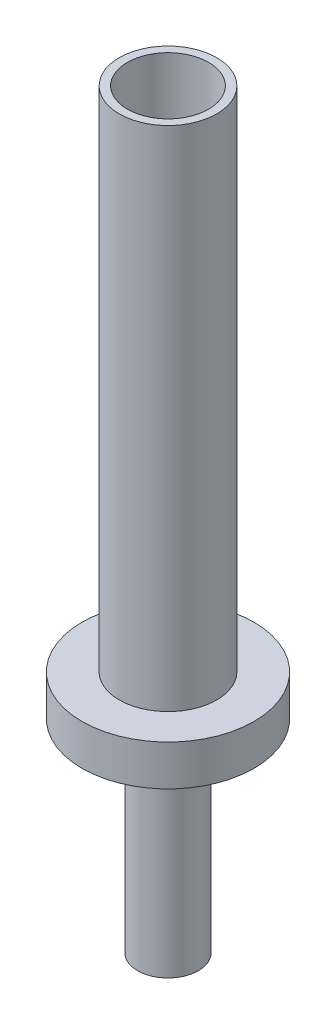
ISO-10303-21;
HEADER;
FILE_DESCRIPTION(('STEP AP214'),'2;1');
FILE_NAME('part.step','',(''),(''),'','','');
FILE_SCHEMA(('AUTOMOTIVE_DESIGN { 1 0 10303 214 1 1 1 1 }'));
ENDSEC;
DATA;
#1=APPLICATION_CONTEXT('core data for automotive mechanical design processes');
#2=APPLICATION_PROTOCOL_DEFINITION('international standard','automotive_design',2000,#1);
#3=PRODUCT_CONTEXT('',#1,'mechanical');
#4=PRODUCT('Part','Part','',(#3));
#5=PRODUCT_RELATED_PRODUCT_CATEGORY('part','',(#4));
#6=PRODUCT_DEFINITION_FORMATION('','',#4);
#7=PRODUCT_DEFINITION_CONTEXT('part definition',#1,'design');
#8=PRODUCT_DEFINITION('design','',#6,#7);
#9=PRODUCT_DEFINITION_SHAPE('','',#8);
#10=(LENGTH_UNIT() NAMED_UNIT(*) SI_UNIT(.MILLI.,.METRE.));
#11=(NAMED_UNIT(*) PLANE_ANGLE_UNIT() SI_UNIT($,.RADIAN.));
#12=(NAMED_UNIT(*) SI_UNIT($,.STERADIAN.) SOLID_ANGLE_UNIT());
#13=UNCERTAINTY_MEASURE_WITH_UNIT(LENGTH_MEASURE(1.E-05),#10,'distance_accuracy_value','');
#14=(GEOMETRIC_REPRESENTATION_CONTEXT(3) GLOBAL_UNCERTAINTY_ASSIGNED_CONTEXT((#13)) GLOBAL_UNIT_ASSIGNED_CONTEXT((#10,
#11,#12)) REPRESENTATION_CONTEXT('',''));
#15=CARTESIAN_POINT('',(0.,0.,0.));
#16=DIRECTION('',(0.,0.,1.));
#17=DIRECTION('',(1.,0.,0.));
#18=AXIS2_PLACEMENT_3D('',#15,#16,#17);
#19=CARTESIAN_POINT('',(0.,50.,0.));
#20=DIRECTION('',(0.,-1.,0.));
#21=DIRECTION('',(0.,0.,-1.));
#22=AXIS2_PLACEMENT_3D('',#19,#20,#21);
#23=CYLINDRICAL_SURFACE('',#22,7.49999999999999);
#24=CARTESIAN_POINT('',(0.,50.,0.));
#25=DIRECTION('',(0.,1.,0.));
#26=DIRECTION('',(0.,0.,1.));
#27=AXIS2_PLACEMENT_3D('',#24,#25,#26);
#28=CIRCLE('',#27,7.49999999999999);
#29=CARTESIAN_POINT('',(0.,50.,7.49999999999999));
#30=VERTEX_POINT('',#29);
#31=EDGE_CURVE('E43',#30,#30,#28,.T.);
#32=ORIENTED_EDGE('',*,*,#31,.F.);
#33=EDGE_LOOP('',(#32));
#34=FACE_BOUND('',#33,.T.);
#35=CARTESIAN_POINT('',(0.,0.,0.));
#36=DIRECTION('',(0.,1.,0.));
#37=DIRECTION('',(0.,0.,1.));
#38=AXIS2_PLACEMENT_3D('',#35,#36,#37);
#39=CIRCLE('',#38,7.49999999999999);
#40=CARTESIAN_POINT('',(0.,0.,7.49999999999999));
#41=VERTEX_POINT('',#40);
#42=EDGE_CURVE('E47',#41,#41,#39,.T.);
#43=ORIENTED_EDGE('',*,*,#42,.T.);
#44=EDGE_LOOP('',(#43));
#45=FACE_BOUND('',#44,.T.);
#46=ADVANCED_FACE('F37',(#34,#45),#23,.T.);
#47=CARTESIAN_POINT('',(0.,0.,0.));
#48=DIRECTION('',(0.,1.,0.));
#49=DIRECTION('',(0.,0.,1.));
#50=AXIS2_PLACEMENT_3D('',#47,#48,#49);
#51=PLANE('',#50);
#52=ORIENTED_EDGE('',*,*,#42,.F.);
#53=EDGE_LOOP('',(#52));
#54=FACE_BOUND('',#53,.T.);
#55=ADVANCED_FACE('F88',(#54),#51,.F.);
#56=CARTESIAN_POINT('',(0.,60.,0.));
#57=DIRECTION('',(0.,-1.,0.));
#58=DIRECTION('',(0.,0.,-1.));
#59=AXIS2_PLACEMENT_3D('',#56,#57,#58);
#60=CYLINDRICAL_SURFACE('',#59,21.18392150893);
#61=CARTESIAN_POINT('',(0.,60.,0.));
#62=DIRECTION('',(0.,1.,0.));
#63=DIRECTION('',(0.,0.,1.));
#64=AXIS2_PLACEMENT_3D('',#61,#62,#63);
#65=CIRCLE('',#64,21.18392150893);
#66=CARTESIAN_POINT('',(0.,60.,21.18392150893));
#67=VERTEX_POINT('',#66);
#68=EDGE_CURVE('E52',#67,#67,#65,.T.);
#69=ORIENTED_EDGE('',*,*,#68,.F.);
#70=EDGE_LOOP('',(#69));
#71=FACE_BOUND('',#70,.T.);
#72=CARTESIAN_POINT('',(0.,50.,0.));
#73=DIRECTION('',(0.,1.,0.));
#74=DIRECTION('',(0.,0.,1.));
#75=AXIS2_PLACEMENT_3D('',#72,#73,#74);
#76=CIRCLE('',#75,21.18392150893);
#77=CARTESIAN_POINT('',(0.,50.,21.18392150893));
#78=VERTEX_POINT('',#77);
#79=EDGE_CURVE('E54',#78,#78,#76,.T.);
#80=ORIENTED_EDGE('',*,*,#79,.T.);
#81=EDGE_LOOP('',(#80));
#82=FACE_BOUND('',#81,.T.);
#83=ADVANCED_FACE('F93',(#71,#82),#60,.T.);
#84=CARTESIAN_POINT('',(0.,60.,0.));
#85=DIRECTION('',(0.,1.,0.));
#86=DIRECTION('',(0.,0.,1.));
#87=AXIS2_PLACEMENT_3D('',#84,#85,#86);
#88=PLANE('',#87);
#89=CARTESIAN_POINT('',(0.,60.,0.));
#90=DIRECTION('',(0.,1.,0.));
#91=DIRECTION('',(0.,0.,1.));
#92=AXIS2_PLACEMENT_3D('',#89,#90,#91);
#93=CIRCLE('',#92,12.);
#94=CARTESIAN_POINT('',(0.,60.,12.));
#95=VERTEX_POINT('',#94);
#96=EDGE_CURVE('E60',#95,#95,#93,.T.);
#97=ORIENTED_EDGE('',*,*,#96,.F.);
#98=EDGE_LOOP('',(#97));
#99=FACE_BOUND('',#98,.T.);
#100=ORIENTED_EDGE('',*,*,#68,.T.);
#101=EDGE_LOOP('',(#100));
#102=FACE_BOUND('',#101,.T.);
#103=ADVANCED_FACE('F84',(#99,#102),#88,.T.);
#104=CARTESIAN_POINT('',(0.,50.,0.));
#105=DIRECTION('',(0.,1.,0.));
#106=DIRECTION('',(0.,0.,1.));
#107=AXIS2_PLACEMENT_3D('',#104,#105,#106);
#108=PLANE('',#107);
#109=ORIENTED_EDGE('',*,*,#31,.T.);
#110=EDGE_LOOP('',(#109));
#111=FACE_BOUND('',#110,.T.);
#112=ORIENTED_EDGE('',*,*,#79,.F.);
#113=EDGE_LOOP('',(#112));
#114=FACE_BOUND('',#113,.T.);
#115=ADVANCED_FACE('F74',(#111,#114),#108,.F.);
#116=CARTESIAN_POINT('',(0.,185.,0.));
#117=DIRECTION('',(0.,1.,0.));
#118=DIRECTION('',(0.,0.,1.));
#119=AXIS2_PLACEMENT_3D('',#116,#117,#118);
#120=PLANE('',#119);
#121=CARTESIAN_POINT('',(0.,185.,0.));
#122=DIRECTION('',(0.,1.,0.));
#123=DIRECTION('',(0.,0.,1.));
#124=AXIS2_PLACEMENT_3D('',#121,#122,#123);
#125=CIRCLE('',#124,12.);
#126=CARTESIAN_POINT('',(0.,185.,12.));
#127=VERTEX_POINT('',#126);
#128=EDGE_CURVE('E57',#127,#127,#125,.T.);
#129=ORIENTED_EDGE('',*,*,#128,.T.);
#130=EDGE_LOOP('',(#129));
#131=FACE_BOUND('',#130,.T.);
#132=CARTESIAN_POINT('',(0.,185.,0.));
#133=DIRECTION('',(0.,1.,0.));
#134=DIRECTION('',(0.,0.,1.));
#135=AXIS2_PLACEMENT_3D('',#132,#133,#134);
#136=CIRCLE('',#135,10.);
#137=CARTESIAN_POINT('',(0.,185.,10.));
#138=VERTEX_POINT('',#137);
#139=EDGE_CURVE('E63',#138,#138,#136,.T.);
#140=ORIENTED_EDGE('',*,*,#139,.F.);
#141=EDGE_LOOP('',(#140));
#142=FACE_BOUND('',#141,.T.);
#143=ADVANCED_FACE('F71',(#131,#142),#120,.T.);
#144=CARTESIAN_POINT('',(0.,185.,0.));
#145=DIRECTION('',(0.,-1.,0.));
#146=DIRECTION('',(0.,0.,-1.));
#147=AXIS2_PLACEMENT_3D('',#144,#145,#146);
#148=CYLINDRICAL_SURFACE('',#147,12.);
#149=ORIENTED_EDGE('',*,*,#128,.F.);
#150=EDGE_LOOP('',(#149));
#151=FACE_BOUND('',#150,.T.);
#152=ORIENTED_EDGE('',*,*,#96,.T.);
#153=EDGE_LOOP('',(#152));
#154=FACE_BOUND('',#153,.T.);
#155=ADVANCED_FACE('F73',(#151,#154),#148,.T.);
#156=CARTESIAN_POINT('',(0.,185.,0.));
#157=DIRECTION('',(0.,-1.,0.));
#158=DIRECTION('',(0.,0.,-1.));
#159=AXIS2_PLACEMENT_3D('',#156,#157,#158);
#160=CYLINDRICAL_SURFACE('',#159,10.);
#161=ORIENTED_EDGE('',*,*,#139,.T.);
#162=EDGE_LOOP('',(#161));
#163=FACE_BOUND('',#162,.T.);
#164=CARTESIAN_POINT('',(0.,60.,0.));
#165=DIRECTION('',(0.,1.,0.));
#166=DIRECTION('',(0.,0.,1.));
#167=AXIS2_PLACEMENT_3D('',#164,#165,#166);
#168=CIRCLE('',#167,10.);
#169=CARTESIAN_POINT('',(0.,60.,10.));
#170=VERTEX_POINT('',#169);
#171=EDGE_CURVE('E10',#170,#170,#168,.F.);
#172=ORIENTED_EDGE('',*,*,#171,.T.);
#173=EDGE_LOOP('',(#172));
#174=FACE_BOUND('',#173,.T.);
#175=ADVANCED_FACE('F69',(#163,#174),#160,.F.);
#176=ORIENTED_EDGE('',*,*,#171,.F.);
#177=EDGE_LOOP('',(#176));
#178=FACE_BOUND('',#177,.T.);
#179=ADVANCED_FACE('F104',(#178),#88,.T.);
#180=CLOSED_SHELL('',(#46,#55,#83,#103,#115,#143,#155,#175,#179));
#181=MANIFOLD_SOLID_BREP('B2',#180);
#182=ADVANCED_BREP_SHAPE_REPRESENTATION('',(#18,#181),#14);
#183=SHAPE_DEFINITION_REPRESENTATION(#9,#182);
ENDSEC;
END-ISO-10303-21;
